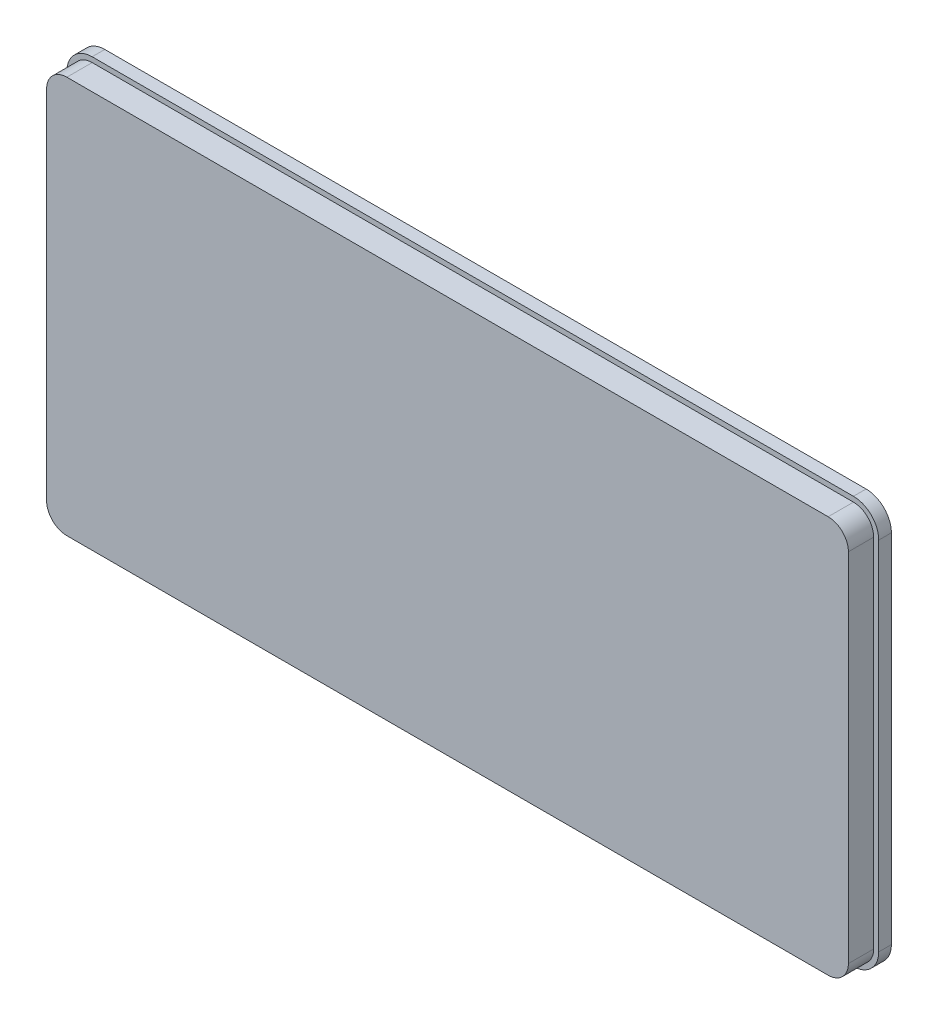
ISO-10303-21;
HEADER;
FILE_DESCRIPTION(('STEP AP214'),'2;1');
FILE_NAME('part.step','',(''),(''),'','','');
FILE_SCHEMA(('AUTOMOTIVE_DESIGN { 1 0 10303 214 1 1 1 1 }'));
ENDSEC;
DATA;
#1=APPLICATION_CONTEXT('core data for automotive mechanical design processes');
#2=APPLICATION_PROTOCOL_DEFINITION('international standard','automotive_design',2000,#1);
#3=PRODUCT_CONTEXT('',#1,'mechanical');
#4=PRODUCT('Part','Part','',(#3));
#5=PRODUCT_RELATED_PRODUCT_CATEGORY('part','',(#4));
#6=PRODUCT_DEFINITION_FORMATION('','',#4);
#7=PRODUCT_DEFINITION_CONTEXT('part definition',#1,'design');
#8=PRODUCT_DEFINITION('design','',#6,#7);
#9=PRODUCT_DEFINITION_SHAPE('','',#8);
#10=(LENGTH_UNIT() NAMED_UNIT(*) SI_UNIT(.MILLI.,.METRE.));
#11=(NAMED_UNIT(*) PLANE_ANGLE_UNIT() SI_UNIT($,.RADIAN.));
#12=(NAMED_UNIT(*) SI_UNIT($,.STERADIAN.) SOLID_ANGLE_UNIT());
#13=UNCERTAINTY_MEASURE_WITH_UNIT(LENGTH_MEASURE(1.E-05),#10,'distance_accuracy_value','');
#14=(GEOMETRIC_REPRESENTATION_CONTEXT(3) GLOBAL_UNCERTAINTY_ASSIGNED_CONTEXT((#13)) GLOBAL_UNIT_ASSIGNED_CONTEXT((#10,
#11,#12)) REPRESENTATION_CONTEXT('',''));
#15=CARTESIAN_POINT('',(0.,0.,0.));
#16=DIRECTION('',(0.,0.,1.));
#17=DIRECTION('',(1.,0.,0.));
#18=AXIS2_PLACEMENT_3D('',#15,#16,#17);
#19=CARTESIAN_POINT('',(150.5,-70.5,0.));
#20=DIRECTION('',(0.,0.,1.));
#21=DIRECTION('',(1.,0.,0.));
#22=AXIS2_PLACEMENT_3D('',#19,#20,#21);
#23=PLANE('',#22);
#24=CARTESIAN_POINT('',(150.5,-70.5,0.));
#25=DIRECTION('',(0.,0.,1.));
#26=DIRECTION('',(1.,0.,0.));
#27=AXIS2_PLACEMENT_3D('',#24,#25,#26);
#28=CIRCLE('',#27,10.0000000000001);
#29=CARTESIAN_POINT('',(150.5,-80.5000000000001,0.));
#30=VERTEX_POINT('',#29);
#31=CARTESIAN_POINT('',(160.5,-70.5,0.));
#32=VERTEX_POINT('',#31);
#33=EDGE_CURVE('E146',#30,#32,#28,.T.);
#34=ORIENTED_EDGE('',*,*,#33,.T.);
#35=DIRECTION('',(0.,1.,0.));
#36=VECTOR('',#35,1.);
#37=CARTESIAN_POINT('',(160.5,70.5,0.));
#38=LINE('',#37,#36);
#39=CARTESIAN_POINT('',(160.5,70.5,0.));
#40=VERTEX_POINT('',#39);
#41=EDGE_CURVE('E149',#32,#40,#38,.T.);
#42=ORIENTED_EDGE('',*,*,#41,.T.);
#43=CARTESIAN_POINT('',(150.5,70.5,0.));
#44=DIRECTION('',(0.,0.,1.));
#45=DIRECTION('',(-1.,0.,0.));
#46=AXIS2_PLACEMENT_3D('',#43,#44,#45);
#47=CIRCLE('',#46,10.0000000000001);
#48=CARTESIAN_POINT('',(150.5,80.5000000000001,0.));
#49=VERTEX_POINT('',#48);
#50=EDGE_CURVE('E153',#40,#49,#47,.T.);
#51=ORIENTED_EDGE('',*,*,#50,.T.);
#52=DIRECTION('',(-1.,0.,0.));
#53=VECTOR('',#52,1.);
#54=CARTESIAN_POINT('',(-150.5,80.5,0.));
#55=LINE('',#54,#53);
#56=CARTESIAN_POINT('',(-150.5,80.5,0.));
#57=VERTEX_POINT('',#56);
#58=EDGE_CURVE('E156',#49,#57,#55,.T.);
#59=ORIENTED_EDGE('',*,*,#58,.T.);
#60=CARTESIAN_POINT('',(-150.5,70.4999999999999,0.));
#61=DIRECTION('',(0.,0.,1.));
#62=DIRECTION('',(1.,0.,0.));
#63=AXIS2_PLACEMENT_3D('',#60,#61,#62);
#64=CIRCLE('',#63,10.0000000000001);
#65=CARTESIAN_POINT('',(-160.5,70.4999999999999,0.));
#66=VERTEX_POINT('',#65);
#67=EDGE_CURVE('E159',#57,#66,#64,.T.);
#68=ORIENTED_EDGE('',*,*,#67,.T.);
#69=DIRECTION('',(0.,-1.,0.));
#70=VECTOR('',#69,1.);
#71=CARTESIAN_POINT('',(-160.5,70.4999999999999,0.));
#72=LINE('',#71,#70);
#73=CARTESIAN_POINT('',(-160.5,-70.5,0.));
#74=VERTEX_POINT('',#73);
#75=EDGE_CURVE('E162',#66,#74,#72,.T.);
#76=ORIENTED_EDGE('',*,*,#75,.T.);
#77=CARTESIAN_POINT('',(-150.5,-70.5,0.));
#78=DIRECTION('',(0.,0.,1.));
#79=DIRECTION('',(1.,0.,0.));
#80=AXIS2_PLACEMENT_3D('',#77,#78,#79);
#81=CIRCLE('',#80,10.);
#82=CARTESIAN_POINT('',(-150.5,-80.5,0.));
#83=VERTEX_POINT('',#82);
#84=EDGE_CURVE('E123',#74,#83,#81,.T.);
#85=ORIENTED_EDGE('',*,*,#84,.T.);
#86=DIRECTION('',(1.,0.,0.));
#87=VECTOR('',#86,1.);
#88=CARTESIAN_POINT('',(-150.5,-80.5,0.));
#89=LINE('',#88,#87);
#90=EDGE_CURVE('E165',#83,#30,#89,.T.);
#91=ORIENTED_EDGE('',*,*,#90,.T.);
#92=EDGE_LOOP('',(#34,#42,#51,#59,#68,#76,#85,#91));
#93=FACE_BOUND('',#92,.T.);
#94=DIRECTION('',(0.,-1.,0.));
#95=VECTOR('',#94,1.);
#96=CARTESIAN_POINT('',(158.5,70.5,0.));
#97=LINE('',#96,#95);
#98=CARTESIAN_POINT('',(158.5,70.5,0.));
#99=VERTEX_POINT('',#98);
#100=CARTESIAN_POINT('',(158.5,-70.5,0.));
#101=VERTEX_POINT('',#100);
#102=EDGE_CURVE('E244',#99,#101,#97,.T.);
#103=ORIENTED_EDGE('',*,*,#102,.T.);
#104=CARTESIAN_POINT('',(150.5,-70.5,0.));
#105=DIRECTION('',(0.,0.,-1.));
#106=DIRECTION('',(-1.,0.,0.));
#107=AXIS2_PLACEMENT_3D('',#104,#105,#106);
#108=CIRCLE('',#107,8.00000000000007);
#109=CARTESIAN_POINT('',(150.5,-78.5,0.));
#110=VERTEX_POINT('',#109);
#111=EDGE_CURVE('E52',#101,#110,#108,.T.);
#112=ORIENTED_EDGE('',*,*,#111,.T.);
#113=DIRECTION('',(-1.,0.,0.));
#114=VECTOR('',#113,1.);
#115=CARTESIAN_POINT('',(150.5,-78.5,0.));
#116=LINE('',#115,#114);
#117=CARTESIAN_POINT('',(-150.5,-78.5,0.));
#118=VERTEX_POINT('',#117);
#119=EDGE_CURVE('E262',#110,#118,#116,.T.);
#120=ORIENTED_EDGE('',*,*,#119,.T.);
#121=CARTESIAN_POINT('',(-150.5,-70.5,0.));
#122=DIRECTION('',(0.,0.,-1.));
#123=DIRECTION('',(-1.,0.,0.));
#124=AXIS2_PLACEMENT_3D('',#121,#122,#123);
#125=CIRCLE('',#124,8.00000000000003);
#126=CARTESIAN_POINT('',(-158.5,-70.5,0.));
#127=VERTEX_POINT('',#126);
#128=EDGE_CURVE('E265',#118,#127,#125,.T.);
#129=ORIENTED_EDGE('',*,*,#128,.T.);
#130=DIRECTION('',(0.,1.,0.));
#131=VECTOR('',#130,1.);
#132=CARTESIAN_POINT('',(-158.5,-70.5,0.));
#133=LINE('',#132,#131);
#134=CARTESIAN_POINT('',(-158.5,70.4999999999999,0.));
#135=VERTEX_POINT('',#134);
#136=EDGE_CURVE('E268',#127,#135,#133,.T.);
#137=ORIENTED_EDGE('',*,*,#136,.T.);
#138=CARTESIAN_POINT('',(-150.5,70.4999999999999,0.));
#139=DIRECTION('',(0.,0.,-1.));
#140=DIRECTION('',(-1.,0.,0.));
#141=AXIS2_PLACEMENT_3D('',#138,#139,#140);
#142=CIRCLE('',#141,8.00000000000004);
#143=CARTESIAN_POINT('',(-150.5,78.5,0.));
#144=VERTEX_POINT('',#143);
#145=EDGE_CURVE('E271',#135,#144,#142,.T.);
#146=ORIENTED_EDGE('',*,*,#145,.T.);
#147=DIRECTION('',(1.,0.,0.));
#148=VECTOR('',#147,1.);
#149=CARTESIAN_POINT('',(-150.5,78.5,0.));
#150=LINE('',#149,#148);
#151=CARTESIAN_POINT('',(150.5,78.5000000000001,0.));
#152=VERTEX_POINT('',#151);
#153=EDGE_CURVE('E274',#144,#152,#150,.T.);
#154=ORIENTED_EDGE('',*,*,#153,.T.);
#155=CARTESIAN_POINT('',(150.5,70.5,0.));
#156=DIRECTION('',(0.,0.,-1.));
#157=DIRECTION('',(-1.,0.,0.));
#158=AXIS2_PLACEMENT_3D('',#155,#156,#157);
#159=CIRCLE('',#158,8.0000000000001);
#160=EDGE_CURVE('E277',#152,#99,#159,.T.);
#161=ORIENTED_EDGE('',*,*,#160,.T.);
#162=EDGE_LOOP('',(#103,#112,#120,#129,#137,#146,#154,#161));
#163=FACE_BOUND('',#162,.T.);
#164=ADVANCED_FACE('F35',(#93,#163),#23,.T.);
#165=CARTESIAN_POINT('',(150.5,-70.5,-5.));
#166=DIRECTION('',(0.,0.,1.));
#167=DIRECTION('',(1.,0.,0.));
#168=AXIS2_PLACEMENT_3D('',#165,#166,#167);
#169=CYLINDRICAL_SURFACE('',#168,10.0000000000001);
#170=ORIENTED_EDGE('',*,*,#33,.F.);
#171=DIRECTION('',(0.,0.,1.));
#172=VECTOR('',#171,1.);
#173=CARTESIAN_POINT('',(150.5,-80.5000000000001,-5.));
#174=LINE('',#173,#172);
#175=CARTESIAN_POINT('',(150.5,-80.5000000000001,-5.));
#176=VERTEX_POINT('',#175);
#177=EDGE_CURVE('E11',#176,#30,#174,.T.);
#178=ORIENTED_EDGE('',*,*,#177,.F.);
#179=CARTESIAN_POINT('',(150.5,-70.5,-5.));
#180=DIRECTION('',(0.,0.,1.));
#181=DIRECTION('',(1.,0.,0.));
#182=AXIS2_PLACEMENT_3D('',#179,#180,#181);
#183=CIRCLE('',#182,10.0000000000001);
#184=CARTESIAN_POINT('',(160.5,-70.5,-5.));
#185=VERTEX_POINT('',#184);
#186=EDGE_CURVE('E167',#176,#185,#183,.T.);
#187=ORIENTED_EDGE('',*,*,#186,.T.);
#188=DIRECTION('',(0.,0.,1.));
#189=VECTOR('',#188,1.);
#190=CARTESIAN_POINT('',(160.5,-70.5,-5.));
#191=LINE('',#190,#189);
#192=EDGE_CURVE('E39',#185,#32,#191,.T.);
#193=ORIENTED_EDGE('',*,*,#192,.T.);
#194=EDGE_LOOP('',(#170,#178,#187,#193));
#195=FACE_BOUND('',#194,.T.);
#196=ADVANCED_FACE('F37',(#195),#169,.T.);
#197=CARTESIAN_POINT('',(-150.5,-80.5,-5.));
#198=DIRECTION('',(0.,-1.,0.));
#199=DIRECTION('',(1.,0.,0.));
#200=AXIS2_PLACEMENT_3D('',#197,#198,#199);
#201=PLANE('',#200);
#202=ORIENTED_EDGE('',*,*,#90,.F.);
#203=DIRECTION('',(0.,0.,1.));
#204=VECTOR('',#203,1.);
#205=CARTESIAN_POINT('',(-150.5,-80.5,-5.));
#206=LINE('',#205,#204);
#207=CARTESIAN_POINT('',(-150.5,-80.5,-5.));
#208=VERTEX_POINT('',#207);
#209=EDGE_CURVE('E44',#208,#83,#206,.T.);
#210=ORIENTED_EDGE('',*,*,#209,.F.);
#211=DIRECTION('',(1.,0.,0.));
#212=VECTOR('',#211,1.);
#213=CARTESIAN_POINT('',(-150.5,-80.5,-5.));
#214=LINE('',#213,#212);
#215=EDGE_CURVE('E136',#208,#176,#214,.T.);
#216=ORIENTED_EDGE('',*,*,#215,.T.);
#217=ORIENTED_EDGE('',*,*,#177,.T.);
#218=EDGE_LOOP('',(#202,#210,#216,#217));
#219=FACE_BOUND('',#218,.T.);
#220=ADVANCED_FACE('F179',(#219),#201,.T.);
#221=CARTESIAN_POINT('',(-150.5,-70.5,-5.));
#222=DIRECTION('',(0.,0.,1.));
#223=DIRECTION('',(1.,0.,0.));
#224=AXIS2_PLACEMENT_3D('',#221,#222,#223);
#225=CYLINDRICAL_SURFACE('',#224,10.);
#226=ORIENTED_EDGE('',*,*,#84,.F.);
#227=DIRECTION('',(0.,0.,1.));
#228=VECTOR('',#227,1.);
#229=CARTESIAN_POINT('',(-160.5,-70.5,-5.));
#230=LINE('',#229,#228);
#231=CARTESIAN_POINT('',(-160.5,-70.5,-5.));
#232=VERTEX_POINT('',#231);
#233=EDGE_CURVE('E117',#232,#74,#230,.T.);
#234=ORIENTED_EDGE('',*,*,#233,.F.);
#235=CARTESIAN_POINT('',(-150.5,-70.5,-5.));
#236=DIRECTION('',(0.,0.,1.));
#237=DIRECTION('',(1.,0.,0.));
#238=AXIS2_PLACEMENT_3D('',#235,#236,#237);
#239=CIRCLE('',#238,10.);
#240=EDGE_CURVE('E120',#232,#208,#239,.T.);
#241=ORIENTED_EDGE('',*,*,#240,.T.);
#242=ORIENTED_EDGE('',*,*,#209,.T.);
#243=EDGE_LOOP('',(#226,#234,#241,#242));
#244=FACE_BOUND('',#243,.T.);
#245=ADVANCED_FACE('F119',(#244),#225,.T.);
#246=CARTESIAN_POINT('',(-160.5,70.4999999999999,-5.));
#247=DIRECTION('',(-1.,0.,0.));
#248=DIRECTION('',(0.,-1.,0.));
#249=AXIS2_PLACEMENT_3D('',#246,#247,#248);
#250=PLANE('',#249);
#251=ORIENTED_EDGE('',*,*,#75,.F.);
#252=DIRECTION('',(0.,0.,1.));
#253=VECTOR('',#252,1.);
#254=CARTESIAN_POINT('',(-160.5,70.4999999999999,-5.));
#255=LINE('',#254,#253);
#256=CARTESIAN_POINT('',(-160.5,70.4999999999999,-5.));
#257=VERTEX_POINT('',#256);
#258=EDGE_CURVE('E128',#257,#66,#255,.T.);
#259=ORIENTED_EDGE('',*,*,#258,.F.);
#260=DIRECTION('',(0.,-1.,0.));
#261=VECTOR('',#260,1.);
#262=CARTESIAN_POINT('',(-160.5,70.4999999999999,-5.));
#263=LINE('',#262,#261);
#264=EDGE_CURVE('E134',#257,#232,#263,.T.);
#265=ORIENTED_EDGE('',*,*,#264,.T.);
#266=ORIENTED_EDGE('',*,*,#233,.T.);
#267=EDGE_LOOP('',(#251,#259,#265,#266));
#268=FACE_BOUND('',#267,.T.);
#269=ADVANCED_FACE('F138',(#268),#250,.T.);
#270=CARTESIAN_POINT('',(-150.5,70.4999999999999,-5.));
#271=DIRECTION('',(0.,0.,1.));
#272=DIRECTION('',(1.,0.,0.));
#273=AXIS2_PLACEMENT_3D('',#270,#271,#272);
#274=CYLINDRICAL_SURFACE('',#273,10.0000000000001);
#275=ORIENTED_EDGE('',*,*,#67,.F.);
#276=DIRECTION('',(0.,0.,1.));
#277=VECTOR('',#276,1.);
#278=CARTESIAN_POINT('',(-150.5,80.5,-5.));
#279=LINE('',#278,#277);
#280=CARTESIAN_POINT('',(-150.5,80.5,-5.));
#281=VERTEX_POINT('',#280);
#282=EDGE_CURVE('E171',#281,#57,#279,.T.);
#283=ORIENTED_EDGE('',*,*,#282,.F.);
#284=CARTESIAN_POINT('',(-150.5,70.4999999999999,-5.));
#285=DIRECTION('',(0.,0.,1.));
#286=DIRECTION('',(1.,0.,0.));
#287=AXIS2_PLACEMENT_3D('',#284,#285,#286);
#288=CIRCLE('',#287,10.0000000000001);
#289=EDGE_CURVE('E139',#281,#257,#288,.T.);
#290=ORIENTED_EDGE('',*,*,#289,.T.);
#291=ORIENTED_EDGE('',*,*,#258,.T.);
#292=EDGE_LOOP('',(#275,#283,#290,#291));
#293=FACE_BOUND('',#292,.T.);
#294=ADVANCED_FACE('F312',(#293),#274,.T.);
#295=CARTESIAN_POINT('',(-150.5,80.5,-5.));
#296=DIRECTION('',(0.,1.,0.));
#297=DIRECTION('',(-1.,0.,0.));
#298=AXIS2_PLACEMENT_3D('',#295,#296,#297);
#299=PLANE('',#298);
#300=ORIENTED_EDGE('',*,*,#58,.F.);
#301=DIRECTION('',(0.,0.,1.));
#302=VECTOR('',#301,1.);
#303=CARTESIAN_POINT('',(150.5,80.5000000000001,-5.));
#304=LINE('',#303,#302);
#305=CARTESIAN_POINT('',(150.5,80.5000000000001,-5.));
#306=VERTEX_POINT('',#305);
#307=EDGE_CURVE('E173',#306,#49,#304,.T.);
#308=ORIENTED_EDGE('',*,*,#307,.F.);
#309=DIRECTION('',(-1.,0.,0.));
#310=VECTOR('',#309,1.);
#311=CARTESIAN_POINT('',(-150.5,80.5,-5.));
#312=LINE('',#311,#310);
#313=EDGE_CURVE('E141',#306,#281,#312,.T.);
#314=ORIENTED_EDGE('',*,*,#313,.T.);
#315=ORIENTED_EDGE('',*,*,#282,.T.);
#316=EDGE_LOOP('',(#300,#308,#314,#315));
#317=FACE_BOUND('',#316,.T.);
#318=ADVANCED_FACE('F306',(#317),#299,.T.);
#319=CARTESIAN_POINT('',(150.5,70.5,-5.));
#320=DIRECTION('',(0.,0.,1.));
#321=DIRECTION('',(1.,0.,0.));
#322=AXIS2_PLACEMENT_3D('',#319,#320,#321);
#323=CYLINDRICAL_SURFACE('',#322,10.0000000000001);
#324=ORIENTED_EDGE('',*,*,#50,.F.);
#325=DIRECTION('',(0.,0.,1.));
#326=VECTOR('',#325,1.);
#327=CARTESIAN_POINT('',(160.5,70.5,-5.));
#328=LINE('',#327,#326);
#329=CARTESIAN_POINT('',(160.5,70.5,-5.));
#330=VERTEX_POINT('',#329);
#331=EDGE_CURVE('E174',#330,#40,#328,.T.);
#332=ORIENTED_EDGE('',*,*,#331,.F.);
#333=CARTESIAN_POINT('',(150.5,70.5,-5.));
#334=DIRECTION('',(0.,0.,1.));
#335=DIRECTION('',(-1.,0.,0.));
#336=AXIS2_PLACEMENT_3D('',#333,#334,#335);
#337=CIRCLE('',#336,10.0000000000001);
#338=EDGE_CURVE('E300',#330,#306,#337,.T.);
#339=ORIENTED_EDGE('',*,*,#338,.T.);
#340=ORIENTED_EDGE('',*,*,#307,.T.);
#341=EDGE_LOOP('',(#324,#332,#339,#340));
#342=FACE_BOUND('',#341,.T.);
#343=ADVANCED_FACE('F310',(#342),#323,.T.);
#344=CARTESIAN_POINT('',(160.5,70.5,-5.));
#345=DIRECTION('',(1.,0.,0.));
#346=DIRECTION('',(0.,0.,-1.));
#347=AXIS2_PLACEMENT_3D('',#344,#345,#346);
#348=PLANE('',#347);
#349=ORIENTED_EDGE('',*,*,#41,.F.);
#350=ORIENTED_EDGE('',*,*,#192,.F.);
#351=DIRECTION('',(0.,1.,0.));
#352=VECTOR('',#351,1.);
#353=CARTESIAN_POINT('',(160.5,70.5,-5.));
#354=LINE('',#353,#352);
#355=EDGE_CURVE('E298',#185,#330,#354,.T.);
#356=ORIENTED_EDGE('',*,*,#355,.T.);
#357=ORIENTED_EDGE('',*,*,#331,.T.);
#358=EDGE_LOOP('',(#349,#350,#356,#357));
#359=FACE_BOUND('',#358,.T.);
#360=ADVANCED_FACE('F176',(#359),#348,.T.);
#361=CARTESIAN_POINT('',(150.5,-70.5,-5.));
#362=DIRECTION('',(0.,0.,1.));
#363=DIRECTION('',(1.,0.,0.));
#364=AXIS2_PLACEMENT_3D('',#361,#362,#363);
#365=PLANE('',#364);
#366=ORIENTED_EDGE('',*,*,#186,.F.);
#367=ORIENTED_EDGE('',*,*,#215,.F.);
#368=ORIENTED_EDGE('',*,*,#240,.F.);
#369=ORIENTED_EDGE('',*,*,#264,.F.);
#370=ORIENTED_EDGE('',*,*,#289,.F.);
#371=ORIENTED_EDGE('',*,*,#313,.F.);
#372=ORIENTED_EDGE('',*,*,#338,.F.);
#373=ORIENTED_EDGE('',*,*,#355,.F.);
#374=EDGE_LOOP('',(#366,#367,#368,#369,#370,#371,#372,#373));
#375=FACE_BOUND('',#374,.T.);
#376=ADVANCED_FACE('F132',(#375),#365,.F.);
#377=CARTESIAN_POINT('',(150.5,-70.5,10.));
#378=DIRECTION('',(0.,0.,-1.));
#379=DIRECTION('',(-1.,0.,0.));
#380=AXIS2_PLACEMENT_3D('',#377,#378,#379);
#381=CYLINDRICAL_SURFACE('',#380,8.00000000000007);
#382=ORIENTED_EDGE('',*,*,#111,.F.);
#383=DIRECTION('',(0.,0.,-1.));
#384=VECTOR('',#383,1.);
#385=CARTESIAN_POINT('',(158.5,-70.5,10.));
#386=LINE('',#385,#384);
#387=CARTESIAN_POINT('',(158.5,-70.5,10.));
#388=VERTEX_POINT('',#387);
#389=EDGE_CURVE('E150',#388,#101,#386,.T.);
#390=ORIENTED_EDGE('',*,*,#389,.F.);
#391=CARTESIAN_POINT('',(150.5,-70.5,10.));
#392=DIRECTION('',(0.,0.,-1.));
#393=DIRECTION('',(-1.,0.,0.));
#394=AXIS2_PLACEMENT_3D('',#391,#392,#393);
#395=CIRCLE('',#394,8.00000000000007);
#396=CARTESIAN_POINT('',(150.5,-78.5,10.));
#397=VERTEX_POINT('',#396);
#398=EDGE_CURVE('E234',#388,#397,#395,.T.);
#399=ORIENTED_EDGE('',*,*,#398,.T.);
#400=DIRECTION('',(0.,0.,-1.));
#401=VECTOR('',#400,1.);
#402=CARTESIAN_POINT('',(150.5,-78.5,10.));
#403=LINE('',#402,#401);
#404=EDGE_CURVE('E252',#397,#110,#403,.T.);
#405=ORIENTED_EDGE('',*,*,#404,.T.);
#406=EDGE_LOOP('',(#382,#390,#399,#405));
#407=FACE_BOUND('',#406,.T.);
#408=ADVANCED_FACE('F194',(#407),#381,.T.);
#409=CARTESIAN_POINT('',(158.5,70.5,10.));
#410=DIRECTION('',(1.,0.,0.));
#411=DIRECTION('',(0.,1.,0.));
#412=AXIS2_PLACEMENT_3D('',#409,#410,#411);
#413=PLANE('',#412);
#414=ORIENTED_EDGE('',*,*,#102,.F.);
#415=DIRECTION('',(0.,0.,-1.));
#416=VECTOR('',#415,1.);
#417=CARTESIAN_POINT('',(158.5,70.5,10.));
#418=LINE('',#417,#416);
#419=CARTESIAN_POINT('',(158.5,70.5,10.));
#420=VERTEX_POINT('',#419);
#421=EDGE_CURVE('E250',#420,#99,#418,.T.);
#422=ORIENTED_EDGE('',*,*,#421,.F.);
#423=DIRECTION('',(0.,-1.,0.));
#424=VECTOR('',#423,1.);
#425=CARTESIAN_POINT('',(158.5,70.5,10.));
#426=LINE('',#425,#424);
#427=EDGE_CURVE('E238',#420,#388,#426,.T.);
#428=ORIENTED_EDGE('',*,*,#427,.T.);
#429=ORIENTED_EDGE('',*,*,#389,.T.);
#430=EDGE_LOOP('',(#414,#422,#428,#429));
#431=FACE_BOUND('',#430,.T.);
#432=ADVANCED_FACE('F197',(#431),#413,.T.);
#433=CARTESIAN_POINT('',(150.5,70.5,10.));
#434=DIRECTION('',(0.,0.,-1.));
#435=DIRECTION('',(-1.,0.,0.));
#436=AXIS2_PLACEMENT_3D('',#433,#434,#435);
#437=CYLINDRICAL_SURFACE('',#436,8.0000000000001);
#438=ORIENTED_EDGE('',*,*,#160,.F.);
#439=DIRECTION('',(0.,0.,-1.));
#440=VECTOR('',#439,1.);
#441=CARTESIAN_POINT('',(150.5,78.5000000000001,10.));
#442=LINE('',#441,#440);
#443=CARTESIAN_POINT('',(150.5,78.5000000000001,10.));
#444=VERTEX_POINT('',#443);
#445=EDGE_CURVE('E283',#444,#152,#442,.T.);
#446=ORIENTED_EDGE('',*,*,#445,.F.);
#447=CARTESIAN_POINT('',(150.5,70.5,10.));
#448=DIRECTION('',(0.,0.,-1.));
#449=DIRECTION('',(-1.,0.,0.));
#450=AXIS2_PLACEMENT_3D('',#447,#448,#449);
#451=CIRCLE('',#450,8.0000000000001);
#452=EDGE_CURVE('E253',#444,#420,#451,.T.);
#453=ORIENTED_EDGE('',*,*,#452,.T.);
#454=ORIENTED_EDGE('',*,*,#421,.T.);
#455=EDGE_LOOP('',(#438,#446,#453,#454));
#456=FACE_BOUND('',#455,.T.);
#457=ADVANCED_FACE('F218',(#456),#437,.T.);
#458=CARTESIAN_POINT('',(-150.5,78.5,10.));
#459=DIRECTION('',(0.,1.,0.));
#460=DIRECTION('',(-1.,0.,0.));
#461=AXIS2_PLACEMENT_3D('',#458,#459,#460);
#462=PLANE('',#461);
#463=ORIENTED_EDGE('',*,*,#153,.F.);
#464=DIRECTION('',(0.,0.,-1.));
#465=VECTOR('',#464,1.);
#466=CARTESIAN_POINT('',(-150.5,78.5,10.));
#467=LINE('',#466,#465);
#468=CARTESIAN_POINT('',(-150.5,78.5,10.));
#469=VERTEX_POINT('',#468);
#470=EDGE_CURVE('E286',#469,#144,#467,.T.);
#471=ORIENTED_EDGE('',*,*,#470,.F.);
#472=DIRECTION('',(1.,0.,0.));
#473=VECTOR('',#472,1.);
#474=CARTESIAN_POINT('',(-150.5,78.5,10.));
#475=LINE('',#474,#473);
#476=EDGE_CURVE('E257',#469,#444,#475,.T.);
#477=ORIENTED_EDGE('',*,*,#476,.T.);
#478=ORIENTED_EDGE('',*,*,#445,.T.);
#479=EDGE_LOOP('',(#463,#471,#477,#478));
#480=FACE_BOUND('',#479,.T.);
#481=ADVANCED_FACE('F214',(#480),#462,.T.);
#482=CARTESIAN_POINT('',(-150.5,70.4999999999999,10.));
#483=DIRECTION('',(0.,0.,-1.));
#484=DIRECTION('',(-1.,0.,0.));
#485=AXIS2_PLACEMENT_3D('',#482,#483,#484);
#486=CYLINDRICAL_SURFACE('',#485,8.00000000000004);
#487=ORIENTED_EDGE('',*,*,#145,.F.);
#488=DIRECTION('',(0.,0.,-1.));
#489=VECTOR('',#488,1.);
#490=CARTESIAN_POINT('',(-158.5,70.4999999999999,10.));
#491=LINE('',#490,#489);
#492=CARTESIAN_POINT('',(-158.5,70.4999999999999,10.));
#493=VERTEX_POINT('',#492);
#494=EDGE_CURVE('E289',#493,#135,#491,.T.);
#495=ORIENTED_EDGE('',*,*,#494,.F.);
#496=CARTESIAN_POINT('',(-150.5,70.4999999999999,10.));
#497=DIRECTION('',(0.,0.,-1.));
#498=DIRECTION('',(-1.,0.,0.));
#499=AXIS2_PLACEMENT_3D('',#496,#497,#498);
#500=CIRCLE('',#499,8.00000000000004);
#501=EDGE_CURVE('E469',#493,#469,#500,.T.);
#502=ORIENTED_EDGE('',*,*,#501,.T.);
#503=ORIENTED_EDGE('',*,*,#470,.T.);
#504=EDGE_LOOP('',(#487,#495,#502,#503));
#505=FACE_BOUND('',#504,.T.);
#506=ADVANCED_FACE('F210',(#505),#486,.T.);
#507=CARTESIAN_POINT('',(-158.5,-70.5,10.));
#508=DIRECTION('',(-1.,0.,0.));
#509=DIRECTION('',(0.,-1.,0.));
#510=AXIS2_PLACEMENT_3D('',#507,#508,#509);
#511=PLANE('',#510);
#512=ORIENTED_EDGE('',*,*,#136,.F.);
#513=DIRECTION('',(0.,0.,-1.));
#514=VECTOR('',#513,1.);
#515=CARTESIAN_POINT('',(-158.5,-70.5,10.));
#516=LINE('',#515,#514);
#517=CARTESIAN_POINT('',(-158.5,-70.5,10.));
#518=VERTEX_POINT('',#517);
#519=EDGE_CURVE('E292',#518,#127,#516,.T.);
#520=ORIENTED_EDGE('',*,*,#519,.F.);
#521=DIRECTION('',(0.,1.,0.));
#522=VECTOR('',#521,1.);
#523=CARTESIAN_POINT('',(-158.5,-70.5,10.));
#524=LINE('',#523,#522);
#525=EDGE_CURVE('E470',#518,#493,#524,.T.);
#526=ORIENTED_EDGE('',*,*,#525,.T.);
#527=ORIENTED_EDGE('',*,*,#494,.T.);
#528=EDGE_LOOP('',(#512,#520,#526,#527));
#529=FACE_BOUND('',#528,.T.);
#530=ADVANCED_FACE('F206',(#529),#511,.T.);
#531=CARTESIAN_POINT('',(-150.5,-70.5,10.));
#532=DIRECTION('',(0.,0.,-1.));
#533=DIRECTION('',(-1.,0.,0.));
#534=AXIS2_PLACEMENT_3D('',#531,#532,#533);
#535=CYLINDRICAL_SURFACE('',#534,8.00000000000003);
#536=ORIENTED_EDGE('',*,*,#128,.F.);
#537=DIRECTION('',(0.,0.,-1.));
#538=VECTOR('',#537,1.);
#539=CARTESIAN_POINT('',(-150.5,-78.5,10.));
#540=LINE('',#539,#538);
#541=CARTESIAN_POINT('',(-150.5,-78.5,10.));
#542=VERTEX_POINT('',#541);
#543=EDGE_CURVE('E255',#542,#118,#540,.T.);
#544=ORIENTED_EDGE('',*,*,#543,.F.);
#545=CARTESIAN_POINT('',(-150.5,-70.5,10.));
#546=DIRECTION('',(0.,0.,-1.));
#547=DIRECTION('',(-1.,0.,0.));
#548=AXIS2_PLACEMENT_3D('',#545,#546,#547);
#549=CIRCLE('',#548,8.00000000000003);
#550=EDGE_CURVE('E475',#542,#518,#549,.T.);
#551=ORIENTED_EDGE('',*,*,#550,.T.);
#552=ORIENTED_EDGE('',*,*,#519,.T.);
#553=EDGE_LOOP('',(#536,#544,#551,#552));
#554=FACE_BOUND('',#553,.T.);
#555=ADVANCED_FACE('F202',(#554),#535,.T.);
#556=CARTESIAN_POINT('',(150.5,-78.5,10.));
#557=DIRECTION('',(0.,-1.,0.));
#558=DIRECTION('',(1.,0.,0.));
#559=AXIS2_PLACEMENT_3D('',#556,#557,#558);
#560=PLANE('',#559);
#561=ORIENTED_EDGE('',*,*,#119,.F.);
#562=ORIENTED_EDGE('',*,*,#404,.F.);
#563=DIRECTION('',(-1.,0.,0.));
#564=VECTOR('',#563,1.);
#565=CARTESIAN_POINT('',(150.5,-78.5,10.));
#566=LINE('',#565,#564);
#567=EDGE_CURVE('E242',#397,#542,#566,.T.);
#568=ORIENTED_EDGE('',*,*,#567,.T.);
#569=ORIENTED_EDGE('',*,*,#543,.T.);
#570=EDGE_LOOP('',(#561,#562,#568,#569));
#571=FACE_BOUND('',#570,.T.);
#572=ADVANCED_FACE('F198',(#571),#560,.T.);
#573=CARTESIAN_POINT('',(150.5,-70.5,10.));
#574=DIRECTION('',(0.,0.,-1.));
#575=DIRECTION('',(-1.,0.,0.));
#576=AXIS2_PLACEMENT_3D('',#573,#574,#575);
#577=PLANE('',#576);
#578=ORIENTED_EDGE('',*,*,#398,.F.);
#579=ORIENTED_EDGE('',*,*,#427,.F.);
#580=ORIENTED_EDGE('',*,*,#452,.F.);
#581=ORIENTED_EDGE('',*,*,#476,.F.);
#582=ORIENTED_EDGE('',*,*,#501,.F.);
#583=ORIENTED_EDGE('',*,*,#525,.F.);
#584=ORIENTED_EDGE('',*,*,#550,.F.);
#585=ORIENTED_EDGE('',*,*,#567,.F.);
#586=EDGE_LOOP('',(#578,#579,#580,#581,#582,#583,#584,#585));
#587=FACE_BOUND('',#586,.T.);
#588=ADVANCED_FACE('F201',(#587),#577,.F.);
#589=CLOSED_SHELL('',(#164,#196,#220,#245,#269,#294,#318,#343,#360,#376,#408,#432,#457,#481,
#506,#530,#555,#572,#588));
#590=MANIFOLD_SOLID_BREP('B2',#589);
#591=ADVANCED_BREP_SHAPE_REPRESENTATION('',(#18,#590),#14);
#592=SHAPE_DEFINITION_REPRESENTATION(#9,#591);
ENDSEC;
END-ISO-10303-21;
